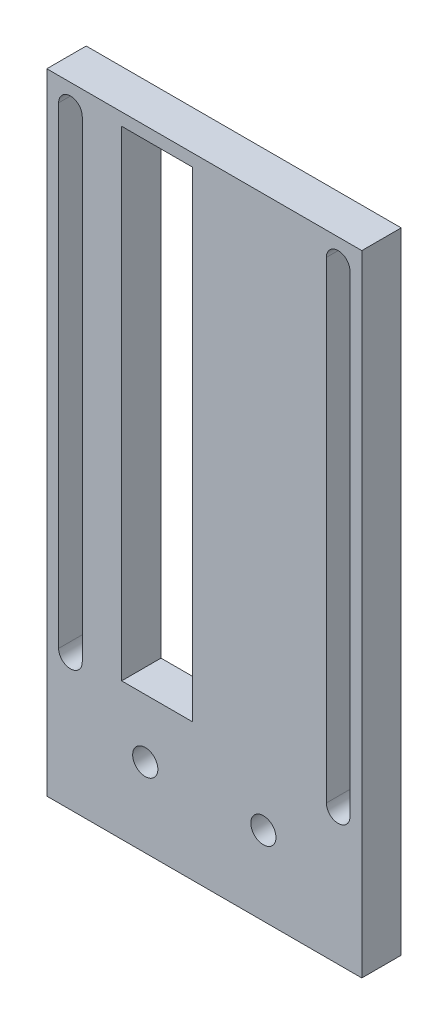
ISO-10303-21;
HEADER;
FILE_DESCRIPTION(('STEP AP214'),'2;1');
FILE_NAME('part.step','',(''),(''),'','','');
FILE_SCHEMA(('AUTOMOTIVE_DESIGN { 1 0 10303 214 1 1 1 1 }'));
ENDSEC;
DATA;
#1=APPLICATION_CONTEXT('core data for automotive mechanical design processes');
#2=APPLICATION_PROTOCOL_DEFINITION('international standard','automotive_design',2000,#1);
#3=PRODUCT_CONTEXT('',#1,'mechanical');
#4=PRODUCT('Part','Part','',(#3));
#5=PRODUCT_RELATED_PRODUCT_CATEGORY('part','',(#4));
#6=PRODUCT_DEFINITION_FORMATION('','',#4);
#7=PRODUCT_DEFINITION_CONTEXT('part definition',#1,'design');
#8=PRODUCT_DEFINITION('design','',#6,#7);
#9=PRODUCT_DEFINITION_SHAPE('','',#8);
#10=(LENGTH_UNIT() NAMED_UNIT(*) SI_UNIT(.MILLI.,.METRE.));
#11=(NAMED_UNIT(*) PLANE_ANGLE_UNIT() SI_UNIT($,.RADIAN.));
#12=(NAMED_UNIT(*) SI_UNIT($,.STERADIAN.) SOLID_ANGLE_UNIT());
#13=UNCERTAINTY_MEASURE_WITH_UNIT(LENGTH_MEASURE(1.E-05),#10,'distance_accuracy_value','');
#14=(GEOMETRIC_REPRESENTATION_CONTEXT(3) GLOBAL_UNCERTAINTY_ASSIGNED_CONTEXT((#13)) GLOBAL_UNIT_ASSIGNED_CONTEXT((#10,
#11,#12)) REPRESENTATION_CONTEXT('',''));
#15=CARTESIAN_POINT('',(0.,0.,0.));
#16=DIRECTION('',(0.,0.,1.));
#17=DIRECTION('',(1.,0.,0.));
#18=AXIS2_PLACEMENT_3D('',#15,#16,#17);
#19=CARTESIAN_POINT('',(0.,0.,5.));
#20=DIRECTION('',(0.,0.,-1.));
#21=DIRECTION('',(-1.,0.,0.));
#22=AXIS2_PLACEMENT_3D('',#19,#20,#21);
#23=PLANE('',#22);
#24=DIRECTION('',(-1.,0.,0.));
#25=VECTOR('',#24,1.);
#26=CARTESIAN_POINT('',(-1.50000000000001,7.42832203048415,5.));
#27=LINE('',#26,#25);
#28=CARTESIAN_POINT('',(-1.50000000000001,7.42832203048415,5.));
#29=VERTEX_POINT('',#28);
#30=CARTESIAN_POINT('',(-10.5,7.42832203048415,5.));
#31=VERTEX_POINT('',#30);
#32=EDGE_CURVE('E160',#29,#31,#27,.T.);
#33=ORIENTED_EDGE('',*,*,#32,.T.);
#34=DIRECTION('',(0.,1.,0.));
#35=VECTOR('',#34,1.);
#36=CARTESIAN_POINT('',(-10.5,7.42832203048415,5.));
#37=LINE('',#36,#35);
#38=CARTESIAN_POINT('',(-10.5,68.4255946385806,5.));
#39=VERTEX_POINT('',#38);
#40=EDGE_CURVE('E154',#31,#39,#37,.T.);
#41=ORIENTED_EDGE('',*,*,#40,.T.);
#42=DIRECTION('',(1.,0.,0.));
#43=VECTOR('',#42,1.);
#44=CARTESIAN_POINT('',(-1.50000000000001,68.4255946385806,5.));
#45=LINE('',#44,#43);
#46=CARTESIAN_POINT('',(-1.50000000000001,68.4255946385806,5.));
#47=VERTEX_POINT('',#46);
#48=EDGE_CURVE('E163',#39,#47,#45,.T.);
#49=ORIENTED_EDGE('',*,*,#48,.T.);
#50=DIRECTION('',(0.,-1.,0.));
#51=VECTOR('',#50,1.);
#52=CARTESIAN_POINT('',(-1.50000000000001,7.42832203048415,5.));
#53=LINE('',#52,#51);
#54=EDGE_CURVE('E54',#47,#29,#53,.T.);
#55=ORIENTED_EDGE('',*,*,#54,.T.);
#56=EDGE_LOOP('',(#33,#41,#49,#55));
#57=FACE_BOUND('',#56,.T.);
#58=DIRECTION('',(0.,1.,0.));
#59=VECTOR('',#58,1.);
#60=CARTESIAN_POINT('',(15.5,67.,5.));
#61=LINE('',#60,#59);
#62=CARTESIAN_POINT('',(15.5,6.99999999999999,5.));
#63=VERTEX_POINT('',#62);
#64=CARTESIAN_POINT('',(15.5,67.,5.));
#65=VERTEX_POINT('',#64);
#66=EDGE_CURVE('E198',#63,#65,#61,.T.);
#67=ORIENTED_EDGE('',*,*,#66,.T.);
#68=CARTESIAN_POINT('',(17.,67.,5.));
#69=DIRECTION('',(0.,0.,-1.));
#70=DIRECTION('',(-1.,0.,0.));
#71=AXIS2_PLACEMENT_3D('',#68,#69,#70);
#72=CIRCLE('',#71,1.5);
#73=CARTESIAN_POINT('',(18.5,67.,5.));
#74=VERTEX_POINT('',#73);
#75=EDGE_CURVE('E188',#65,#74,#72,.T.);
#76=ORIENTED_EDGE('',*,*,#75,.T.);
#77=DIRECTION('',(0.,-1.,0.));
#78=VECTOR('',#77,1.);
#79=CARTESIAN_POINT('',(18.5,67.,5.));
#80=LINE('',#79,#78);
#81=CARTESIAN_POINT('',(18.5,6.99999999999999,5.));
#82=VERTEX_POINT('',#81);
#83=EDGE_CURVE('E191',#74,#82,#80,.T.);
#84=ORIENTED_EDGE('',*,*,#83,.T.);
#85=CARTESIAN_POINT('',(17.,6.99999999999999,5.));
#86=DIRECTION('',(0.,0.,-1.));
#87=DIRECTION('',(-1.,0.,0.));
#88=AXIS2_PLACEMENT_3D('',#85,#86,#87);
#89=CIRCLE('',#88,1.5);
#90=EDGE_CURVE('E195',#82,#63,#89,.T.);
#91=ORIENTED_EDGE('',*,*,#90,.T.);
#92=EDGE_LOOP('',(#67,#76,#84,#91));
#93=FACE_BOUND('',#92,.T.);
#94=DIRECTION('',(0.,1.,0.));
#95=VECTOR('',#94,1.);
#96=CARTESIAN_POINT('',(-18.5,67.,5.));
#97=LINE('',#96,#95);
#98=CARTESIAN_POINT('',(-18.5,6.99999999999999,5.));
#99=VERTEX_POINT('',#98);
#100=CARTESIAN_POINT('',(-18.5,67.,5.));
#101=VERTEX_POINT('',#100);
#102=EDGE_CURVE('E225',#99,#101,#97,.T.);
#103=ORIENTED_EDGE('',*,*,#102,.T.);
#104=CARTESIAN_POINT('',(-17.,67.,5.));
#105=DIRECTION('',(0.,0.,-1.));
#106=DIRECTION('',(-1.,0.,0.));
#107=AXIS2_PLACEMENT_3D('',#104,#105,#106);
#108=CIRCLE('',#107,1.5);
#109=CARTESIAN_POINT('',(-15.5,67.,5.));
#110=VERTEX_POINT('',#109);
#111=EDGE_CURVE('E235',#101,#110,#108,.T.);
#112=ORIENTED_EDGE('',*,*,#111,.T.);
#113=DIRECTION('',(0.,-1.,0.));
#114=VECTOR('',#113,1.);
#115=CARTESIAN_POINT('',(-15.5,67.,5.));
#116=LINE('',#115,#114);
#117=CARTESIAN_POINT('',(-15.5,6.99999999999999,5.));
#118=VERTEX_POINT('',#117);
#119=EDGE_CURVE('E247',#110,#118,#116,.T.);
#120=ORIENTED_EDGE('',*,*,#119,.T.);
#121=CARTESIAN_POINT('',(-17.,6.99999999999999,5.));
#122=DIRECTION('',(0.,0.,-1.));
#123=DIRECTION('',(-1.,0.,0.));
#124=AXIS2_PLACEMENT_3D('',#121,#122,#123);
#125=CIRCLE('',#124,1.5);
#126=EDGE_CURVE('E244',#118,#99,#125,.T.);
#127=ORIENTED_EDGE('',*,*,#126,.T.);
#128=EDGE_LOOP('',(#103,#112,#120,#127));
#129=FACE_BOUND('',#128,.T.);
#130=DIRECTION('',(0.,1.,0.));
#131=VECTOR('',#130,1.);
#132=CARTESIAN_POINT('',(20.,-10.,5.));
#133=LINE('',#132,#131);
#134=CARTESIAN_POINT('',(20.,-10.,5.));
#135=VERTEX_POINT('',#134);
#136=CARTESIAN_POINT('',(20.,70.,5.));
#137=VERTEX_POINT('',#136);
#138=EDGE_CURVE('E276',#135,#137,#133,.T.);
#139=ORIENTED_EDGE('',*,*,#138,.T.);
#140=DIRECTION('',(1.,0.,0.));
#141=VECTOR('',#140,1.);
#142=CARTESIAN_POINT('',(-20.,70.,5.));
#143=LINE('',#142,#141);
#144=CARTESIAN_POINT('',(-20.,70.,5.));
#145=VERTEX_POINT('',#144);
#146=EDGE_CURVE('E260',#145,#137,#143,.T.);
#147=ORIENTED_EDGE('',*,*,#146,.F.);
#148=DIRECTION('',(0.,-1.,0.));
#149=VECTOR('',#148,1.);
#150=CARTESIAN_POINT('',(-20.,-10.,5.));
#151=LINE('',#150,#149);
#152=CARTESIAN_POINT('',(-20.,-10.,5.));
#153=VERTEX_POINT('',#152);
#154=EDGE_CURVE('E278',#145,#153,#151,.T.);
#155=ORIENTED_EDGE('',*,*,#154,.T.);
#156=DIRECTION('',(1.,0.,0.));
#157=VECTOR('',#156,1.);
#158=CARTESIAN_POINT('',(-20.,-10.,5.));
#159=LINE('',#158,#157);
#160=EDGE_CURVE('E281',#153,#135,#159,.T.);
#161=ORIENTED_EDGE('',*,*,#160,.T.);
#162=EDGE_LOOP('',(#139,#147,#155,#161));
#163=FACE_BOUND('',#162,.T.);
#164=CARTESIAN_POINT('',(-7.5,0.,5.));
#165=DIRECTION('',(0.,0.,1.));
#166=DIRECTION('',(1.,0.,0.));
#167=AXIS2_PLACEMENT_3D('',#164,#165,#166);
#168=CIRCLE('',#167,1.6);
#169=CARTESIAN_POINT('',(-5.9,0.,5.));
#170=VERTEX_POINT('',#169);
#171=EDGE_CURVE('E270',#170,#170,#168,.T.);
#172=ORIENTED_EDGE('',*,*,#171,.F.);
#173=EDGE_LOOP('',(#172));
#174=FACE_BOUND('',#173,.T.);
#175=CARTESIAN_POINT('',(7.5,0.,5.));
#176=DIRECTION('',(0.,0.,1.));
#177=DIRECTION('',(1.,0.,0.));
#178=AXIS2_PLACEMENT_3D('',#175,#176,#177);
#179=CIRCLE('',#178,1.6);
#180=CARTESIAN_POINT('',(9.1,0.,5.));
#181=VERTEX_POINT('',#180);
#182=EDGE_CURVE('E264',#181,#181,#179,.T.);
#183=ORIENTED_EDGE('',*,*,#182,.F.);
#184=EDGE_LOOP('',(#183));
#185=FACE_BOUND('',#184,.T.);
#186=ADVANCED_FACE('F39',(#57,#93,#129,#163,#174,#185),#23,.F.);
#187=CARTESIAN_POINT('',(0.,0.,0.));
#188=DIRECTION('',(0.,0.,-1.));
#189=DIRECTION('',(-1.,0.,0.));
#190=AXIS2_PLACEMENT_3D('',#187,#188,#189);
#191=PLANE('',#190);
#192=DIRECTION('',(0.,1.,0.));
#193=VECTOR('',#192,1.);
#194=CARTESIAN_POINT('',(-10.5,7.42832203048415,0.));
#195=LINE('',#194,#193);
#196=CARTESIAN_POINT('',(-10.5,7.42832203048415,0.));
#197=VERTEX_POINT('',#196);
#198=CARTESIAN_POINT('',(-10.5,68.4255946385806,0.));
#199=VERTEX_POINT('',#198);
#200=EDGE_CURVE('E62',#197,#199,#195,.T.);
#201=ORIENTED_EDGE('',*,*,#200,.F.);
#202=DIRECTION('',(-1.,0.,0.));
#203=VECTOR('',#202,1.);
#204=CARTESIAN_POINT('',(-1.50000000000001,7.42832203048415,0.));
#205=LINE('',#204,#203);
#206=CARTESIAN_POINT('',(-1.50000000000001,7.42832203048415,0.));
#207=VERTEX_POINT('',#206);
#208=EDGE_CURVE('E169',#207,#197,#205,.T.);
#209=ORIENTED_EDGE('',*,*,#208,.F.);
#210=DIRECTION('',(0.,-1.,0.));
#211=VECTOR('',#210,1.);
#212=CARTESIAN_POINT('',(-1.50000000000001,7.42832203048415,0.));
#213=LINE('',#212,#211);
#214=CARTESIAN_POINT('',(-1.50000000000001,68.4255946385806,0.));
#215=VERTEX_POINT('',#214);
#216=EDGE_CURVE('E172',#215,#207,#213,.T.);
#217=ORIENTED_EDGE('',*,*,#216,.F.);
#218=DIRECTION('',(1.,0.,0.));
#219=VECTOR('',#218,1.);
#220=CARTESIAN_POINT('',(-1.50000000000001,68.4255946385806,0.));
#221=LINE('',#220,#219);
#222=EDGE_CURVE('E178',#199,#215,#221,.T.);
#223=ORIENTED_EDGE('',*,*,#222,.F.);
#224=EDGE_LOOP('',(#201,#209,#217,#223));
#225=FACE_BOUND('',#224,.T.);
#226=CARTESIAN_POINT('',(17.,67.,0.));
#227=DIRECTION('',(0.,0.,-1.));
#228=DIRECTION('',(-1.,0.,0.));
#229=AXIS2_PLACEMENT_3D('',#226,#227,#228);
#230=CIRCLE('',#229,1.5);
#231=CARTESIAN_POINT('',(15.5,67.,0.));
#232=VERTEX_POINT('',#231);
#233=CARTESIAN_POINT('',(18.5,67.,0.));
#234=VERTEX_POINT('',#233);
#235=EDGE_CURVE('E202',#232,#234,#230,.T.);
#236=ORIENTED_EDGE('',*,*,#235,.F.);
#237=DIRECTION('',(0.,1.,0.));
#238=VECTOR('',#237,1.);
#239=CARTESIAN_POINT('',(15.5,67.,0.));
#240=LINE('',#239,#238);
#241=CARTESIAN_POINT('',(15.5,6.99999999999999,0.));
#242=VERTEX_POINT('',#241);
#243=EDGE_CURVE('E192',#242,#232,#240,.T.);
#244=ORIENTED_EDGE('',*,*,#243,.F.);
#245=CARTESIAN_POINT('',(17.,6.99999999999999,0.));
#246=DIRECTION('',(0.,0.,-1.));
#247=DIRECTION('',(-1.,0.,0.));
#248=AXIS2_PLACEMENT_3D('',#245,#246,#247);
#249=CIRCLE('',#248,1.5);
#250=CARTESIAN_POINT('',(18.5,6.99999999999999,0.));
#251=VERTEX_POINT('',#250);
#252=EDGE_CURVE('E208',#251,#242,#249,.T.);
#253=ORIENTED_EDGE('',*,*,#252,.F.);
#254=DIRECTION('',(0.,-1.,0.));
#255=VECTOR('',#254,1.);
#256=CARTESIAN_POINT('',(18.5,67.,0.));
#257=LINE('',#256,#255);
#258=EDGE_CURVE('E204',#234,#251,#257,.T.);
#259=ORIENTED_EDGE('',*,*,#258,.F.);
#260=EDGE_LOOP('',(#236,#244,#253,#259));
#261=FACE_BOUND('',#260,.T.);
#262=CARTESIAN_POINT('',(-17.,67.,0.));
#263=DIRECTION('',(0.,0.,-1.));
#264=DIRECTION('',(-1.,0.,0.));
#265=AXIS2_PLACEMENT_3D('',#262,#263,#264);
#266=CIRCLE('',#265,1.5);
#267=CARTESIAN_POINT('',(-18.5,67.,0.));
#268=VERTEX_POINT('',#267);
#269=CARTESIAN_POINT('',(-15.5,67.,0.));
#270=VERTEX_POINT('',#269);
#271=EDGE_CURVE('E205',#268,#270,#266,.T.);
#272=ORIENTED_EDGE('',*,*,#271,.F.);
#273=DIRECTION('',(0.,1.,0.));
#274=VECTOR('',#273,1.);
#275=CARTESIAN_POINT('',(-18.5,67.,0.));
#276=LINE('',#275,#274);
#277=CARTESIAN_POINT('',(-18.5,6.99999999999999,0.));
#278=VERTEX_POINT('',#277);
#279=EDGE_CURVE('E231',#278,#268,#276,.T.);
#280=ORIENTED_EDGE('',*,*,#279,.F.);
#281=CARTESIAN_POINT('',(-17.,6.99999999999999,0.));
#282=DIRECTION('',(0.,0.,-1.));
#283=DIRECTION('',(-1.,0.,0.));
#284=AXIS2_PLACEMENT_3D('',#281,#282,#283);
#285=CIRCLE('',#284,1.5);
#286=CARTESIAN_POINT('',(-15.5,6.99999999999999,0.));
#287=VERTEX_POINT('',#286);
#288=EDGE_CURVE('E234',#287,#278,#285,.T.);
#289=ORIENTED_EDGE('',*,*,#288,.F.);
#290=DIRECTION('',(0.,-1.,0.));
#291=VECTOR('',#290,1.);
#292=CARTESIAN_POINT('',(-15.5,67.,0.));
#293=LINE('',#292,#291);
#294=EDGE_CURVE('E238',#270,#287,#293,.T.);
#295=ORIENTED_EDGE('',*,*,#294,.F.);
#296=EDGE_LOOP('',(#272,#280,#289,#295));
#297=FACE_BOUND('',#296,.T.);
#298=CARTESIAN_POINT('',(-7.5,0.,0.));
#299=DIRECTION('',(0.,0.,1.));
#300=DIRECTION('',(1.,0.,0.));
#301=AXIS2_PLACEMENT_3D('',#298,#299,#300);
#302=CIRCLE('',#301,1.6);
#303=CARTESIAN_POINT('',(-5.9,0.,0.));
#304=VERTEX_POINT('',#303);
#305=EDGE_CURVE('E267',#304,#304,#302,.T.);
#306=ORIENTED_EDGE('',*,*,#305,.T.);
#307=EDGE_LOOP('',(#306));
#308=FACE_BOUND('',#307,.T.);
#309=DIRECTION('',(0.,1.,0.));
#310=VECTOR('',#309,1.);
#311=CARTESIAN_POINT('',(20.,-10.,0.));
#312=LINE('',#311,#310);
#313=CARTESIAN_POINT('',(20.,-10.,0.));
#314=VERTEX_POINT('',#313);
#315=CARTESIAN_POINT('',(20.,70.,0.));
#316=VERTEX_POINT('',#315);
#317=EDGE_CURVE('E273',#314,#316,#312,.T.);
#318=ORIENTED_EDGE('',*,*,#317,.F.);
#319=DIRECTION('',(1.,0.,0.));
#320=VECTOR('',#319,1.);
#321=CARTESIAN_POINT('',(-20.,-10.,0.));
#322=LINE('',#321,#320);
#323=CARTESIAN_POINT('',(-20.,-10.,0.));
#324=VERTEX_POINT('',#323);
#325=EDGE_CURVE('E279',#324,#314,#322,.T.);
#326=ORIENTED_EDGE('',*,*,#325,.F.);
#327=DIRECTION('',(0.,-1.,0.));
#328=VECTOR('',#327,1.);
#329=CARTESIAN_POINT('',(-20.,-10.,0.));
#330=LINE('',#329,#328);
#331=CARTESIAN_POINT('',(-20.,70.,0.));
#332=VERTEX_POINT('',#331);
#333=EDGE_CURVE('E284',#332,#324,#330,.T.);
#334=ORIENTED_EDGE('',*,*,#333,.F.);
#335=DIRECTION('',(-1.,0.,0.));
#336=VECTOR('',#335,1.);
#337=CARTESIAN_POINT('',(20.,70.,0.));
#338=LINE('',#337,#336);
#339=EDGE_CURVE('E254',#316,#332,#338,.T.);
#340=ORIENTED_EDGE('',*,*,#339,.F.);
#341=EDGE_LOOP('',(#318,#326,#334,#340));
#342=FACE_BOUND('',#341,.T.);
#343=CARTESIAN_POINT('',(7.5,0.,0.));
#344=DIRECTION('',(0.,0.,1.));
#345=DIRECTION('',(1.,0.,0.));
#346=AXIS2_PLACEMENT_3D('',#343,#344,#345);
#347=CIRCLE('',#346,1.6);
#348=CARTESIAN_POINT('',(9.1,0.,0.));
#349=VERTEX_POINT('',#348);
#350=EDGE_CURVE('E263',#349,#349,#347,.T.);
#351=ORIENTED_EDGE('',*,*,#350,.T.);
#352=EDGE_LOOP('',(#351));
#353=FACE_BOUND('',#352,.T.);
#354=ADVANCED_FACE('F297',(#225,#261,#297,#308,#342,#353),#191,.T.);
#355=CARTESIAN_POINT('',(20.,-10.,5.));
#356=DIRECTION('',(-1.,0.,0.));
#357=DIRECTION('',(0.,0.,1.));
#358=AXIS2_PLACEMENT_3D('',#355,#356,#357);
#359=PLANE('',#358);
#360=ORIENTED_EDGE('',*,*,#317,.T.);
#361=DIRECTION('',(0.,0.,-1.));
#362=VECTOR('',#361,1.);
#363=CARTESIAN_POINT('',(20.,70.,5.));
#364=LINE('',#363,#362);
#365=EDGE_CURVE('E215',#137,#316,#364,.T.);
#366=ORIENTED_EDGE('',*,*,#365,.F.);
#367=ORIENTED_EDGE('',*,*,#138,.F.);
#368=DIRECTION('',(0.,0.,-1.));
#369=VECTOR('',#368,1.);
#370=CARTESIAN_POINT('',(20.,-10.,5.));
#371=LINE('',#370,#369);
#372=EDGE_CURVE('E47',#135,#314,#371,.T.);
#373=ORIENTED_EDGE('',*,*,#372,.T.);
#374=EDGE_LOOP('',(#360,#366,#367,#373));
#375=FACE_BOUND('',#374,.T.);
#376=ADVANCED_FACE('F41',(#375),#359,.F.);
#377=CARTESIAN_POINT('',(-20.,-10.,5.));
#378=DIRECTION('',(1.,0.,0.));
#379=DIRECTION('',(0.,0.,-1.));
#380=AXIS2_PLACEMENT_3D('',#377,#378,#379);
#381=PLANE('',#380);
#382=ORIENTED_EDGE('',*,*,#333,.T.);
#383=DIRECTION('',(0.,0.,-1.));
#384=VECTOR('',#383,1.);
#385=CARTESIAN_POINT('',(-20.,-10.,5.));
#386=LINE('',#385,#384);
#387=EDGE_CURVE('E11',#153,#324,#386,.T.);
#388=ORIENTED_EDGE('',*,*,#387,.F.);
#389=ORIENTED_EDGE('',*,*,#154,.F.);
#390=DIRECTION('',(0.,0.,1.));
#391=VECTOR('',#390,1.);
#392=CARTESIAN_POINT('',(-20.,70.,0.));
#393=LINE('',#392,#391);
#394=EDGE_CURVE('E257',#332,#145,#393,.T.);
#395=ORIENTED_EDGE('',*,*,#394,.F.);
#396=EDGE_LOOP('',(#382,#388,#389,#395));
#397=FACE_BOUND('',#396,.T.);
#398=ADVANCED_FACE('F308',(#397),#381,.F.);
#399=CARTESIAN_POINT('',(-20.,-10.,5.));
#400=DIRECTION('',(0.,1.,0.));
#401=DIRECTION('',(0.,0.,1.));
#402=AXIS2_PLACEMENT_3D('',#399,#400,#401);
#403=PLANE('',#402);
#404=ORIENTED_EDGE('',*,*,#325,.T.);
#405=ORIENTED_EDGE('',*,*,#372,.F.);
#406=ORIENTED_EDGE('',*,*,#160,.F.);
#407=ORIENTED_EDGE('',*,*,#387,.T.);
#408=EDGE_LOOP('',(#404,#405,#406,#407));
#409=FACE_BOUND('',#408,.T.);
#410=ADVANCED_FACE('F306',(#409),#403,.F.);
#411=CARTESIAN_POINT('',(-7.5,0.,5.));
#412=DIRECTION('',(0.,0.,-1.));
#413=DIRECTION('',(-1.,0.,0.));
#414=AXIS2_PLACEMENT_3D('',#411,#412,#413);
#415=CYLINDRICAL_SURFACE('',#414,1.6);
#416=ORIENTED_EDGE('',*,*,#171,.T.);
#417=EDGE_LOOP('',(#416));
#418=FACE_BOUND('',#417,.T.);
#419=ORIENTED_EDGE('',*,*,#305,.F.);
#420=EDGE_LOOP('',(#419));
#421=FACE_BOUND('',#420,.T.);
#422=ADVANCED_FACE('F314',(#418,#421),#415,.F.);
#423=CARTESIAN_POINT('',(7.5,0.,5.));
#424=DIRECTION('',(0.,0.,-1.));
#425=DIRECTION('',(-1.,0.,0.));
#426=AXIS2_PLACEMENT_3D('',#423,#424,#425);
#427=CYLINDRICAL_SURFACE('',#426,1.6);
#428=ORIENTED_EDGE('',*,*,#182,.T.);
#429=EDGE_LOOP('',(#428));
#430=FACE_BOUND('',#429,.T.);
#431=ORIENTED_EDGE('',*,*,#350,.F.);
#432=EDGE_LOOP('',(#431));
#433=FACE_BOUND('',#432,.T.);
#434=ADVANCED_FACE('F326',(#430,#433),#427,.F.);
#435=CARTESIAN_POINT('',(0.,70.,0.));
#436=DIRECTION('',(0.,1.,0.));
#437=DIRECTION('',(0.,0.,1.));
#438=AXIS2_PLACEMENT_3D('',#435,#436,#437);
#439=PLANE('',#438);
#440=ORIENTED_EDGE('',*,*,#365,.T.);
#441=ORIENTED_EDGE('',*,*,#339,.T.);
#442=ORIENTED_EDGE('',*,*,#394,.T.);
#443=ORIENTED_EDGE('',*,*,#146,.T.);
#444=EDGE_LOOP('',(#440,#441,#442,#443));
#445=FACE_BOUND('',#444,.T.);
#446=ADVANCED_FACE('F301',(#445),#439,.T.);
#447=CARTESIAN_POINT('',(-17.,67.,5.));
#448=DIRECTION('',(0.,0.,-1.));
#449=DIRECTION('',(-1.,0.,0.));
#450=AXIS2_PLACEMENT_3D('',#447,#448,#449);
#451=CYLINDRICAL_SURFACE('',#450,1.5);
#452=ORIENTED_EDGE('',*,*,#271,.T.);
#453=DIRECTION('',(0.,0.,-1.));
#454=VECTOR('',#453,1.);
#455=CARTESIAN_POINT('',(-15.5,67.,5.));
#456=LINE('',#455,#454);
#457=EDGE_CURVE('E222',#110,#270,#456,.T.);
#458=ORIENTED_EDGE('',*,*,#457,.F.);
#459=ORIENTED_EDGE('',*,*,#111,.F.);
#460=DIRECTION('',(0.,0.,-1.));
#461=VECTOR('',#460,1.);
#462=CARTESIAN_POINT('',(-18.5,67.,5.));
#463=LINE('',#462,#461);
#464=EDGE_CURVE('E184',#101,#268,#463,.T.);
#465=ORIENTED_EDGE('',*,*,#464,.T.);
#466=EDGE_LOOP('',(#452,#458,#459,#465));
#467=FACE_BOUND('',#466,.T.);
#468=ADVANCED_FACE('F333',(#467),#451,.F.);
#469=CARTESIAN_POINT('',(-18.5,67.,5.));
#470=DIRECTION('',(-1.,0.,0.));
#471=DIRECTION('',(0.,0.,1.));
#472=AXIS2_PLACEMENT_3D('',#469,#470,#471);
#473=PLANE('',#472);
#474=ORIENTED_EDGE('',*,*,#279,.T.);
#475=ORIENTED_EDGE('',*,*,#464,.F.);
#476=ORIENTED_EDGE('',*,*,#102,.F.);
#477=DIRECTION('',(0.,0.,-1.));
#478=VECTOR('',#477,1.);
#479=CARTESIAN_POINT('',(-18.5,6.99999999999999,5.));
#480=LINE('',#479,#478);
#481=EDGE_CURVE('E228',#99,#278,#480,.T.);
#482=ORIENTED_EDGE('',*,*,#481,.T.);
#483=EDGE_LOOP('',(#474,#475,#476,#482));
#484=FACE_BOUND('',#483,.T.);
#485=ADVANCED_FACE('F334',(#484),#473,.F.);
#486=CARTESIAN_POINT('',(-17.,6.99999999999999,5.));
#487=DIRECTION('',(0.,0.,-1.));
#488=DIRECTION('',(-1.,0.,0.));
#489=AXIS2_PLACEMENT_3D('',#486,#487,#488);
#490=CYLINDRICAL_SURFACE('',#489,1.5);
#491=ORIENTED_EDGE('',*,*,#288,.T.);
#492=ORIENTED_EDGE('',*,*,#481,.F.);
#493=ORIENTED_EDGE('',*,*,#126,.F.);
#494=DIRECTION('',(0.,0.,-1.));
#495=VECTOR('',#494,1.);
#496=CARTESIAN_POINT('',(-15.5,6.99999999999999,5.));
#497=LINE('',#496,#495);
#498=EDGE_CURVE('E226',#118,#287,#497,.T.);
#499=ORIENTED_EDGE('',*,*,#498,.T.);
#500=EDGE_LOOP('',(#491,#492,#493,#499));
#501=FACE_BOUND('',#500,.T.);
#502=ADVANCED_FACE('F337',(#501),#490,.F.);
#503=CARTESIAN_POINT('',(-15.5,67.,5.));
#504=DIRECTION('',(1.,0.,0.));
#505=DIRECTION('',(0.,0.,-1.));
#506=AXIS2_PLACEMENT_3D('',#503,#504,#505);
#507=PLANE('',#506);
#508=ORIENTED_EDGE('',*,*,#294,.T.);
#509=ORIENTED_EDGE('',*,*,#498,.F.);
#510=ORIENTED_EDGE('',*,*,#119,.F.);
#511=ORIENTED_EDGE('',*,*,#457,.T.);
#512=EDGE_LOOP('',(#508,#509,#510,#511));
#513=FACE_BOUND('',#512,.T.);
#514=ADVANCED_FACE('F341',(#513),#507,.F.);
#515=CARTESIAN_POINT('',(17.,67.,5.));
#516=DIRECTION('',(0.,0.,-1.));
#517=DIRECTION('',(-1.,0.,0.));
#518=AXIS2_PLACEMENT_3D('',#515,#516,#517);
#519=CYLINDRICAL_SURFACE('',#518,1.5);
#520=ORIENTED_EDGE('',*,*,#235,.T.);
#521=DIRECTION('',(0.,0.,-1.));
#522=VECTOR('',#521,1.);
#523=CARTESIAN_POINT('',(18.5,67.,5.));
#524=LINE('',#523,#522);
#525=EDGE_CURVE('E201',#74,#234,#524,.T.);
#526=ORIENTED_EDGE('',*,*,#525,.F.);
#527=ORIENTED_EDGE('',*,*,#75,.F.);
#528=DIRECTION('',(0.,0.,-1.));
#529=VECTOR('',#528,1.);
#530=CARTESIAN_POINT('',(15.5,67.,5.));
#531=LINE('',#530,#529);
#532=EDGE_CURVE('E213',#65,#232,#531,.T.);
#533=ORIENTED_EDGE('',*,*,#532,.T.);
#534=EDGE_LOOP('',(#520,#526,#527,#533));
#535=FACE_BOUND('',#534,.T.);
#536=ADVANCED_FACE('F345',(#535),#519,.F.);
#537=CARTESIAN_POINT('',(15.5,67.,5.));
#538=DIRECTION('',(-1.,0.,0.));
#539=DIRECTION('',(0.,0.,1.));
#540=AXIS2_PLACEMENT_3D('',#537,#538,#539);
#541=PLANE('',#540);
#542=ORIENTED_EDGE('',*,*,#243,.T.);
#543=ORIENTED_EDGE('',*,*,#532,.F.);
#544=ORIENTED_EDGE('',*,*,#66,.F.);
#545=DIRECTION('',(0.,0.,-1.));
#546=VECTOR('',#545,1.);
#547=CARTESIAN_POINT('',(15.5,6.99999999999999,5.));
#548=LINE('',#547,#546);
#549=EDGE_CURVE('E216',#63,#242,#548,.T.);
#550=ORIENTED_EDGE('',*,*,#549,.T.);
#551=EDGE_LOOP('',(#542,#543,#544,#550));
#552=FACE_BOUND('',#551,.T.);
#553=ADVANCED_FACE('F352',(#552),#541,.F.);
#554=CARTESIAN_POINT('',(17.,6.99999999999999,5.));
#555=DIRECTION('',(0.,0.,-1.));
#556=DIRECTION('',(-1.,0.,0.));
#557=AXIS2_PLACEMENT_3D('',#554,#555,#556);
#558=CYLINDRICAL_SURFACE('',#557,1.5);
#559=ORIENTED_EDGE('',*,*,#252,.T.);
#560=ORIENTED_EDGE('',*,*,#549,.F.);
#561=ORIENTED_EDGE('',*,*,#90,.F.);
#562=DIRECTION('',(0.,0.,-1.));
#563=VECTOR('',#562,1.);
#564=CARTESIAN_POINT('',(18.5,6.99999999999999,5.));
#565=LINE('',#564,#563);
#566=EDGE_CURVE('E218',#82,#251,#565,.T.);
#567=ORIENTED_EDGE('',*,*,#566,.T.);
#568=EDGE_LOOP('',(#559,#560,#561,#567));
#569=FACE_BOUND('',#568,.T.);
#570=ADVANCED_FACE('F357',(#569),#558,.F.);
#571=CARTESIAN_POINT('',(18.5,67.,5.));
#572=DIRECTION('',(1.,0.,0.));
#573=DIRECTION('',(0.,0.,-1.));
#574=AXIS2_PLACEMENT_3D('',#571,#572,#573);
#575=PLANE('',#574);
#576=ORIENTED_EDGE('',*,*,#258,.T.);
#577=ORIENTED_EDGE('',*,*,#566,.F.);
#578=ORIENTED_EDGE('',*,*,#83,.F.);
#579=ORIENTED_EDGE('',*,*,#525,.T.);
#580=EDGE_LOOP('',(#576,#577,#578,#579));
#581=FACE_BOUND('',#580,.T.);
#582=ADVANCED_FACE('F354',(#581),#575,.F.);
#583=CARTESIAN_POINT('',(-10.5,7.42832203048415,5.));
#584=DIRECTION('',(-1.,0.,0.));
#585=DIRECTION('',(0.,0.,1.));
#586=AXIS2_PLACEMENT_3D('',#583,#584,#585);
#587=PLANE('',#586);
#588=ORIENTED_EDGE('',*,*,#200,.T.);
#589=DIRECTION('',(0.,0.,-1.));
#590=VECTOR('',#589,1.);
#591=CARTESIAN_POINT('',(-10.5,68.4255946385806,5.));
#592=LINE('',#591,#590);
#593=EDGE_CURVE('E150',#39,#199,#592,.T.);
#594=ORIENTED_EDGE('',*,*,#593,.F.);
#595=ORIENTED_EDGE('',*,*,#40,.F.);
#596=DIRECTION('',(0.,0.,-1.));
#597=VECTOR('',#596,1.);
#598=CARTESIAN_POINT('',(-10.5,7.42832203048415,5.));
#599=LINE('',#598,#597);
#600=EDGE_CURVE('E182',#31,#197,#599,.T.);
#601=ORIENTED_EDGE('',*,*,#600,.T.);
#602=EDGE_LOOP('',(#588,#594,#595,#601));
#603=FACE_BOUND('',#602,.T.);
#604=ADVANCED_FACE('F152',(#603),#587,.F.);
#605=CARTESIAN_POINT('',(-1.50000000000001,7.42832203048415,5.));
#606=DIRECTION('',(0.,-1.,0.));
#607=DIRECTION('',(0.,0.,-1.));
#608=AXIS2_PLACEMENT_3D('',#605,#606,#607);
#609=PLANE('',#608);
#610=ORIENTED_EDGE('',*,*,#208,.T.);
#611=ORIENTED_EDGE('',*,*,#600,.F.);
#612=ORIENTED_EDGE('',*,*,#32,.F.);
#613=DIRECTION('',(0.,0.,-1.));
#614=VECTOR('',#613,1.);
#615=CARTESIAN_POINT('',(-1.50000000000001,7.42832203048415,5.));
#616=LINE('',#615,#614);
#617=EDGE_CURVE('E185',#29,#207,#616,.T.);
#618=ORIENTED_EDGE('',*,*,#617,.T.);
#619=EDGE_LOOP('',(#610,#611,#612,#618));
#620=FACE_BOUND('',#619,.T.);
#621=ADVANCED_FACE('F367',(#620),#609,.F.);
#622=CARTESIAN_POINT('',(-1.50000000000001,7.42832203048415,5.));
#623=DIRECTION('',(1.,0.,0.));
#624=DIRECTION('',(0.,0.,-1.));
#625=AXIS2_PLACEMENT_3D('',#622,#623,#624);
#626=PLANE('',#625);
#627=ORIENTED_EDGE('',*,*,#216,.T.);
#628=ORIENTED_EDGE('',*,*,#617,.F.);
#629=ORIENTED_EDGE('',*,*,#54,.F.);
#630=DIRECTION('',(0.,0.,-1.));
#631=VECTOR('',#630,1.);
#632=CARTESIAN_POINT('',(-1.50000000000001,68.4255946385806,5.));
#633=LINE('',#632,#631);
#634=EDGE_CURVE('E159',#47,#215,#633,.T.);
#635=ORIENTED_EDGE('',*,*,#634,.T.);
#636=EDGE_LOOP('',(#627,#628,#629,#635));
#637=FACE_BOUND('',#636,.T.);
#638=ADVANCED_FACE('F370',(#637),#626,.F.);
#639=CARTESIAN_POINT('',(-1.50000000000001,68.4255946385806,5.));
#640=DIRECTION('',(0.,1.,0.));
#641=DIRECTION('',(0.,0.,1.));
#642=AXIS2_PLACEMENT_3D('',#639,#640,#641);
#643=PLANE('',#642);
#644=ORIENTED_EDGE('',*,*,#222,.T.);
#645=ORIENTED_EDGE('',*,*,#634,.F.);
#646=ORIENTED_EDGE('',*,*,#48,.F.);
#647=ORIENTED_EDGE('',*,*,#593,.T.);
#648=EDGE_LOOP('',(#644,#645,#646,#647));
#649=FACE_BOUND('',#648,.T.);
#650=ADVANCED_FACE('F164',(#649),#643,.F.);
#651=CLOSED_SHELL('',(#186,#354,#376,#398,#410,#422,#434,#446,#468,#485,#502,#514,#536,#553,
#570,#582,#604,#621,#638,#650));
#652=MANIFOLD_SOLID_BREP('B2',#651);
#653=ADVANCED_BREP_SHAPE_REPRESENTATION('',(#18,#652),#14);
#654=SHAPE_DEFINITION_REPRESENTATION(#9,#653);
ENDSEC;
END-ISO-10303-21;
